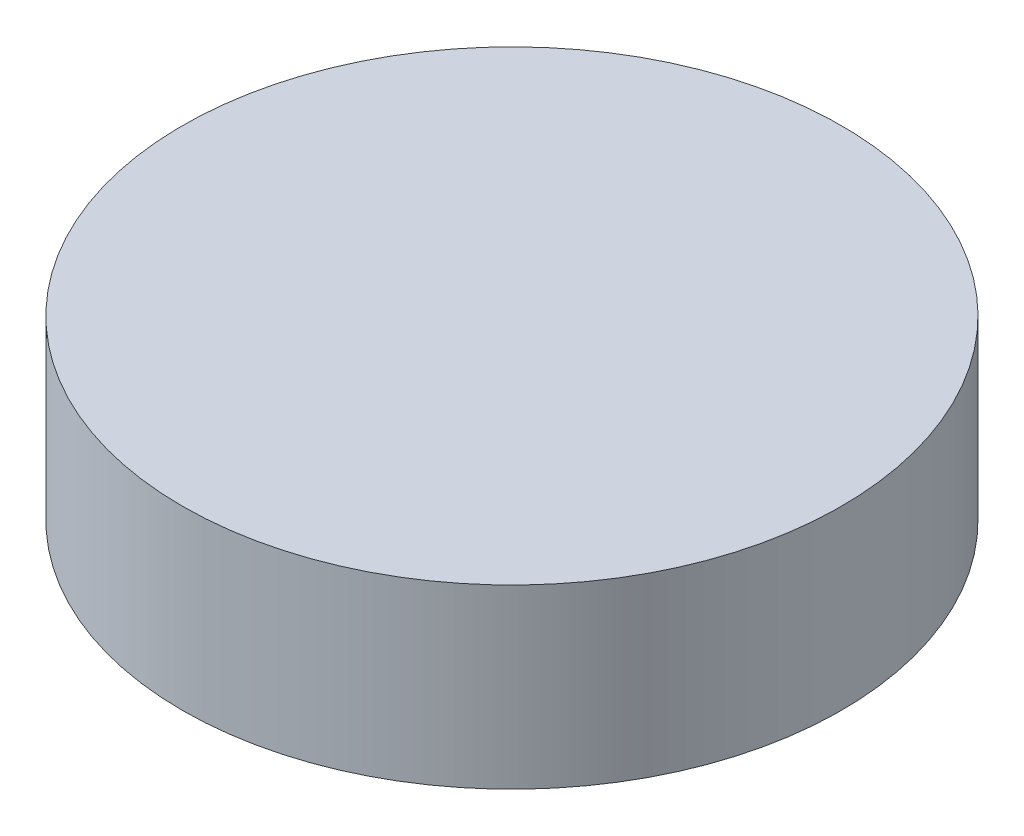
ISO-10303-21;
HEADER;
FILE_DESCRIPTION(('STEP AP214'),'2;1');
FILE_NAME('part.step','',(''),(''),'','','');
FILE_SCHEMA(('AUTOMOTIVE_DESIGN { 1 0 10303 214 1 1 1 1 }'));
ENDSEC;
DATA;
#1=APPLICATION_CONTEXT('core data for automotive mechanical design processes');
#2=APPLICATION_PROTOCOL_DEFINITION('international standard','automotive_design',2000,#1);
#3=PRODUCT_CONTEXT('',#1,'mechanical');
#4=PRODUCT('Part','Part','',(#3));
#5=PRODUCT_RELATED_PRODUCT_CATEGORY('part','',(#4));
#6=PRODUCT_DEFINITION_FORMATION('','',#4);
#7=PRODUCT_DEFINITION_CONTEXT('part definition',#1,'design');
#8=PRODUCT_DEFINITION('design','',#6,#7);
#9=PRODUCT_DEFINITION_SHAPE('','',#8);
#10=(LENGTH_UNIT() NAMED_UNIT(*) SI_UNIT(.MILLI.,.METRE.));
#11=(NAMED_UNIT(*) PLANE_ANGLE_UNIT() SI_UNIT($,.RADIAN.));
#12=(NAMED_UNIT(*) SI_UNIT($,.STERADIAN.) SOLID_ANGLE_UNIT());
#13=UNCERTAINTY_MEASURE_WITH_UNIT(LENGTH_MEASURE(1.E-05),#10,'distance_accuracy_value','');
#14=(GEOMETRIC_REPRESENTATION_CONTEXT(3) GLOBAL_UNCERTAINTY_ASSIGNED_CONTEXT((#13)) GLOBAL_UNIT_ASSIGNED_CONTEXT((#10,
#11,#12)) REPRESENTATION_CONTEXT('',''));
#15=CARTESIAN_POINT('',(0.,0.,0.));
#16=DIRECTION('',(0.,0.,1.));
#17=DIRECTION('',(1.,0.,0.));
#18=AXIS2_PLACEMENT_3D('',#15,#16,#17);
#19=CARTESIAN_POINT('',(0.,7.62,0.));
#20=DIRECTION('',(0.,-1.,0.));
#21=DIRECTION('',(0.,0.,-1.));
#22=AXIS2_PLACEMENT_3D('',#19,#20,#21);
#23=CYLINDRICAL_SURFACE('',#22,14.2);
#24=CARTESIAN_POINT('',(0.,7.62,0.));
#25=DIRECTION('',(0.,1.,0.));
#26=DIRECTION('',(0.,0.,1.));
#27=AXIS2_PLACEMENT_3D('',#24,#25,#26);
#28=CIRCLE('',#27,14.2);
#29=CARTESIAN_POINT('',(0.,7.62,14.2));
#30=VERTEX_POINT('',#29);
#31=EDGE_CURVE('E10',#30,#30,#28,.T.);
#32=ORIENTED_EDGE('',*,*,#31,.F.);
#33=EDGE_LOOP('',(#32));
#34=FACE_BOUND('',#33,.T.);
#35=CARTESIAN_POINT('',(0.,0.,0.));
#36=DIRECTION('',(0.,1.,0.));
#37=DIRECTION('',(0.,0.,1.));
#38=AXIS2_PLACEMENT_3D('',#35,#36,#37);
#39=CIRCLE('',#38,14.2);
#40=CARTESIAN_POINT('',(0.,0.,14.2));
#41=VERTEX_POINT('',#40);
#42=EDGE_CURVE('E40',#41,#41,#39,.T.);
#43=ORIENTED_EDGE('',*,*,#42,.T.);
#44=EDGE_LOOP('',(#43));
#45=FACE_BOUND('',#44,.T.);
#46=ADVANCED_FACE('F37',(#34,#45),#23,.T.);
#47=CARTESIAN_POINT('',(0.,7.62,0.));
#48=DIRECTION('',(0.,1.,0.));
#49=DIRECTION('',(0.,0.,1.));
#50=AXIS2_PLACEMENT_3D('',#47,#48,#49);
#51=PLANE('',#50);
#52=ORIENTED_EDGE('',*,*,#31,.T.);
#53=EDGE_LOOP('',(#52));
#54=FACE_BOUND('',#53,.T.);
#55=ADVANCED_FACE('F52',(#54),#51,.T.);
#56=CARTESIAN_POINT('',(0.,0.,0.));
#57=DIRECTION('',(0.,1.,0.));
#58=DIRECTION('',(0.,0.,1.));
#59=AXIS2_PLACEMENT_3D('',#56,#57,#58);
#60=PLANE('',#59);
#61=ORIENTED_EDGE('',*,*,#42,.F.);
#62=EDGE_LOOP('',(#61));
#63=FACE_BOUND('',#62,.T.);
#64=ADVANCED_FACE('F50',(#63),#60,.F.);
#65=CLOSED_SHELL('',(#46,#55,#64));
#66=MANIFOLD_SOLID_BREP('B2',#65);
#67=ADVANCED_BREP_SHAPE_REPRESENTATION('',(#18,#66),#14);
#68=SHAPE_DEFINITION_REPRESENTATION(#9,#67);
ENDSEC;
END-ISO-10303-21;
